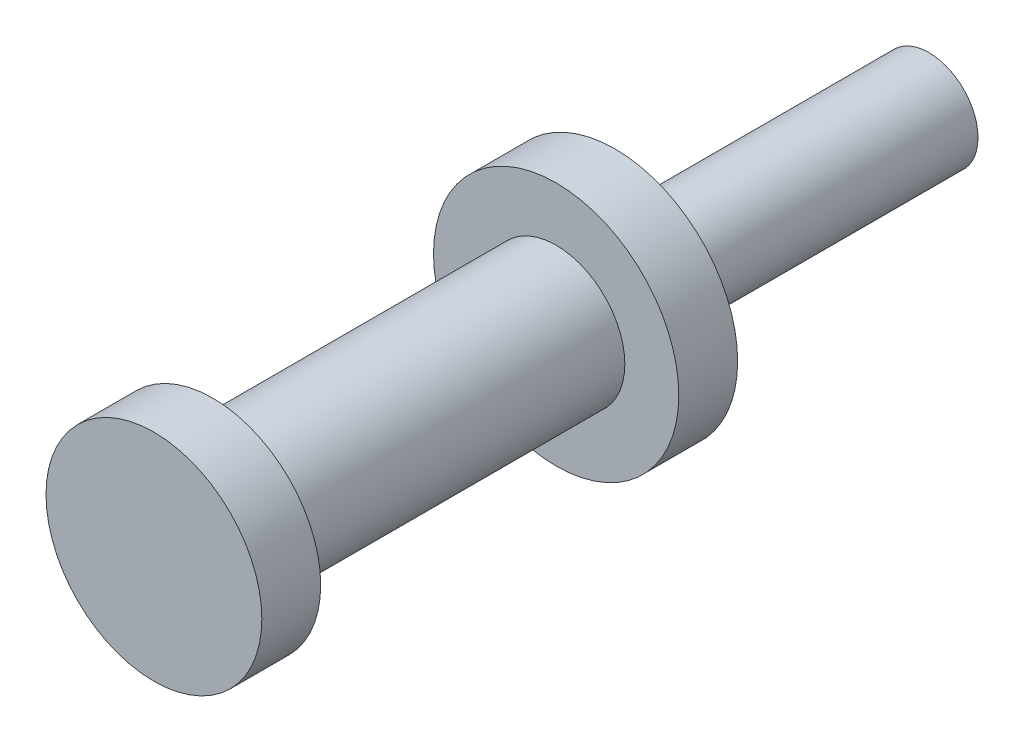
ISO-10303-21;
HEADER;
FILE_DESCRIPTION(('STEP AP214'),'2;1');
FILE_NAME('part.step','',(''),(''),'','','');
FILE_SCHEMA(('AUTOMOTIVE_DESIGN { 1 0 10303 214 1 1 1 1 }'));
ENDSEC;
DATA;
#1=APPLICATION_CONTEXT('core data for automotive mechanical design processes');
#2=APPLICATION_PROTOCOL_DEFINITION('international standard','automotive_design',2000,#1);
#3=PRODUCT_CONTEXT('',#1,'mechanical');
#4=PRODUCT('Part','Part','',(#3));
#5=PRODUCT_RELATED_PRODUCT_CATEGORY('part','',(#4));
#6=PRODUCT_DEFINITION_FORMATION('','',#4);
#7=PRODUCT_DEFINITION_CONTEXT('part definition',#1,'design');
#8=PRODUCT_DEFINITION('design','',#6,#7);
#9=PRODUCT_DEFINITION_SHAPE('','',#8);
#10=(LENGTH_UNIT() NAMED_UNIT(*) SI_UNIT(.MILLI.,.METRE.));
#11=(NAMED_UNIT(*) PLANE_ANGLE_UNIT() SI_UNIT($,.RADIAN.));
#12=(NAMED_UNIT(*) SI_UNIT($,.STERADIAN.) SOLID_ANGLE_UNIT());
#13=UNCERTAINTY_MEASURE_WITH_UNIT(LENGTH_MEASURE(1.E-05),#10,'distance_accuracy_value','');
#14=(GEOMETRIC_REPRESENTATION_CONTEXT(3) GLOBAL_UNCERTAINTY_ASSIGNED_CONTEXT((#13)) GLOBAL_UNIT_ASSIGNED_CONTEXT((#10,
#11,#12)) REPRESENTATION_CONTEXT('',''));
#15=CARTESIAN_POINT('',(0.,0.,0.));
#16=DIRECTION('',(0.,0.,1.));
#17=DIRECTION('',(1.,0.,0.));
#18=AXIS2_PLACEMENT_3D('',#15,#16,#17);
#19=CARTESIAN_POINT('',(0.,0.,0.));
#20=DIRECTION('',(0.,0.,-1.));
#21=DIRECTION('',(-1.,0.,0.));
#22=AXIS2_PLACEMENT_3D('',#19,#20,#21);
#23=PLANE('',#22);
#24=CARTESIAN_POINT('',(0.,-1.1,0.));
#25=DIRECTION('',(0.,0.,1.));
#26=DIRECTION('',(1.,0.,0.));
#27=AXIS2_PLACEMENT_3D('',#24,#25,#26);
#28=CIRCLE('',#27,1.1);
#29=CARTESIAN_POINT('',(1.1,-1.1,0.));
#30=VERTEX_POINT('',#29);
#31=EDGE_CURVE('E59',#30,#30,#28,.T.);
#32=ORIENTED_EDGE('',*,*,#31,.T.);
#33=EDGE_LOOP('',(#32));
#34=FACE_BOUND('',#33,.T.);
#35=ADVANCED_FACE('F31',(#34),#23,.F.);
#36=CARTESIAN_POINT('',(0.,-0.6,-7.9));
#37=DIRECTION('',(0.,0.,1.));
#38=DIRECTION('',(1.,0.,0.));
#39=AXIS2_PLACEMENT_3D('',#36,#37,#38);
#40=PLANE('',#39);
#41=CARTESIAN_POINT('',(0.,-1.1,-7.9));
#42=DIRECTION('',(0.,0.,1.));
#43=DIRECTION('',(1.,0.,0.));
#44=AXIS2_PLACEMENT_3D('',#41,#42,#43);
#45=CIRCLE('',#44,0.5);
#46=CARTESIAN_POINT('',(0.5,-1.1,-7.9));
#47=VERTEX_POINT('',#46);
#48=EDGE_CURVE('E10',#47,#47,#45,.T.);
#49=ORIENTED_EDGE('',*,*,#48,.F.);
#50=EDGE_LOOP('',(#49));
#51=FACE_BOUND('',#50,.T.);
#52=ADVANCED_FACE('F101',(#51),#40,.F.);
#53=CARTESIAN_POINT('',(0.,-1.1,0.));
#54=DIRECTION('',(0.,0.,1.));
#55=DIRECTION('',(1.,0.,0.));
#56=AXIS2_PLACEMENT_3D('',#53,#54,#55);
#57=CYLINDRICAL_SURFACE('',#56,0.5);
#58=CARTESIAN_POINT('',(0.,-1.1,-4.7));
#59=DIRECTION('',(0.,0.,1.));
#60=DIRECTION('',(1.,0.,0.));
#61=AXIS2_PLACEMENT_3D('',#58,#59,#60);
#62=CIRCLE('',#61,0.5);
#63=CARTESIAN_POINT('',(0.5,-1.1,-4.7));
#64=VERTEX_POINT('',#63);
#65=EDGE_CURVE('E37',#64,#64,#62,.T.);
#66=ORIENTED_EDGE('',*,*,#65,.F.);
#67=EDGE_LOOP('',(#66));
#68=FACE_BOUND('',#67,.T.);
#69=ORIENTED_EDGE('',*,*,#48,.T.);
#70=EDGE_LOOP('',(#69));
#71=FACE_BOUND('',#70,.T.);
#72=ADVANCED_FACE('F96',(#68,#71),#57,.T.);
#73=CARTESIAN_POINT('',(0.,0.15,-4.7));
#74=DIRECTION('',(0.,0.,1.));
#75=DIRECTION('',(1.,0.,0.));
#76=AXIS2_PLACEMENT_3D('',#73,#74,#75);
#77=PLANE('',#76);
#78=CARTESIAN_POINT('',(0.,-1.1,-4.7));
#79=DIRECTION('',(0.,0.,1.));
#80=DIRECTION('',(1.,0.,0.));
#81=AXIS2_PLACEMENT_3D('',#78,#79,#80);
#82=CIRCLE('',#81,1.25);
#83=CARTESIAN_POINT('',(1.25,-1.1,-4.7));
#84=VERTEX_POINT('',#83);
#85=EDGE_CURVE('E41',#84,#84,#82,.T.);
#86=ORIENTED_EDGE('',*,*,#85,.F.);
#87=EDGE_LOOP('',(#86));
#88=FACE_BOUND('',#87,.T.);
#89=ORIENTED_EDGE('',*,*,#65,.T.);
#90=EDGE_LOOP('',(#89));
#91=FACE_BOUND('',#90,.T.);
#92=ADVANCED_FACE('F91',(#88,#91),#77,.F.);
#93=CARTESIAN_POINT('',(0.,-1.1,0.));
#94=DIRECTION('',(0.,0.,1.));
#95=DIRECTION('',(1.,0.,0.));
#96=AXIS2_PLACEMENT_3D('',#93,#94,#95);
#97=CYLINDRICAL_SURFACE('',#96,1.25);
#98=CARTESIAN_POINT('',(0.,-1.1,-4.1));
#99=DIRECTION('',(0.,0.,1.));
#100=DIRECTION('',(1.,0.,0.));
#101=AXIS2_PLACEMENT_3D('',#98,#99,#100);
#102=CIRCLE('',#101,1.25);
#103=CARTESIAN_POINT('',(1.25,-1.1,-4.1));
#104=VERTEX_POINT('',#103);
#105=EDGE_CURVE('E45',#104,#104,#102,.T.);
#106=ORIENTED_EDGE('',*,*,#105,.F.);
#107=EDGE_LOOP('',(#106));
#108=FACE_BOUND('',#107,.T.);
#109=ORIENTED_EDGE('',*,*,#85,.T.);
#110=EDGE_LOOP('',(#109));
#111=FACE_BOUND('',#110,.T.);
#112=ADVANCED_FACE('F85',(#108,#111),#97,.T.);
#113=CARTESIAN_POINT('',(0.,-0.4,-4.1));
#114=DIRECTION('',(0.,0.,-1.));
#115=DIRECTION('',(-1.,0.,0.));
#116=AXIS2_PLACEMENT_3D('',#113,#114,#115);
#117=PLANE('',#116);
#118=CARTESIAN_POINT('',(0.,-1.1,-4.1));
#119=DIRECTION('',(0.,0.,1.));
#120=DIRECTION('',(1.,0.,0.));
#121=AXIS2_PLACEMENT_3D('',#118,#119,#120);
#122=CIRCLE('',#121,0.7);
#123=CARTESIAN_POINT('',(0.7,-1.1,-4.1));
#124=VERTEX_POINT('',#123);
#125=EDGE_CURVE('E50',#124,#124,#122,.T.);
#126=ORIENTED_EDGE('',*,*,#125,.F.);
#127=EDGE_LOOP('',(#126));
#128=FACE_BOUND('',#127,.T.);
#129=ORIENTED_EDGE('',*,*,#105,.T.);
#130=EDGE_LOOP('',(#129));
#131=FACE_BOUND('',#130,.T.);
#132=ADVANCED_FACE('F79',(#128,#131),#117,.F.);
#133=CARTESIAN_POINT('',(0.,-1.1,0.));
#134=DIRECTION('',(0.,0.,1.));
#135=DIRECTION('',(1.,0.,0.));
#136=AXIS2_PLACEMENT_3D('',#133,#134,#135);
#137=CYLINDRICAL_SURFACE('',#136,0.7);
#138=CARTESIAN_POINT('',(0.,-1.1,-0.6));
#139=DIRECTION('',(0.,0.,1.));
#140=DIRECTION('',(1.,0.,0.));
#141=AXIS2_PLACEMENT_3D('',#138,#139,#140);
#142=CIRCLE('',#141,0.7);
#143=CARTESIAN_POINT('',(0.7,-1.1,-0.6));
#144=VERTEX_POINT('',#143);
#145=EDGE_CURVE('E53',#144,#144,#142,.T.);
#146=ORIENTED_EDGE('',*,*,#145,.F.);
#147=EDGE_LOOP('',(#146));
#148=FACE_BOUND('',#147,.T.);
#149=ORIENTED_EDGE('',*,*,#125,.T.);
#150=EDGE_LOOP('',(#149));
#151=FACE_BOUND('',#150,.T.);
#152=ADVANCED_FACE('F73',(#148,#151),#137,.T.);
#153=CARTESIAN_POINT('',(0.,0.,-0.6));
#154=DIRECTION('',(0.,0.,1.));
#155=DIRECTION('',(1.,0.,0.));
#156=AXIS2_PLACEMENT_3D('',#153,#154,#155);
#157=PLANE('',#156);
#158=CARTESIAN_POINT('',(0.,-1.1,-0.6));
#159=DIRECTION('',(0.,0.,1.));
#160=DIRECTION('',(1.,0.,0.));
#161=AXIS2_PLACEMENT_3D('',#158,#159,#160);
#162=CIRCLE('',#161,1.1);
#163=CARTESIAN_POINT('',(1.1,-1.1,-0.6));
#164=VERTEX_POINT('',#163);
#165=EDGE_CURVE('E56',#164,#164,#162,.T.);
#166=ORIENTED_EDGE('',*,*,#165,.F.);
#167=EDGE_LOOP('',(#166));
#168=FACE_BOUND('',#167,.T.);
#169=ORIENTED_EDGE('',*,*,#145,.T.);
#170=EDGE_LOOP('',(#169));
#171=FACE_BOUND('',#170,.T.);
#172=ADVANCED_FACE('F67',(#168,#171),#157,.F.);
#173=CARTESIAN_POINT('',(0.,-1.1,0.));
#174=DIRECTION('',(0.,0.,1.));
#175=DIRECTION('',(1.,0.,0.));
#176=AXIS2_PLACEMENT_3D('',#173,#174,#175);
#177=CYLINDRICAL_SURFACE('',#176,1.1);
#178=ORIENTED_EDGE('',*,*,#31,.F.);
#179=EDGE_LOOP('',(#178));
#180=FACE_BOUND('',#179,.T.);
#181=ORIENTED_EDGE('',*,*,#165,.T.);
#182=EDGE_LOOP('',(#181));
#183=FACE_BOUND('',#182,.T.);
#184=ADVANCED_FACE('F64',(#180,#183),#177,.T.);
#185=CLOSED_SHELL('',(#35,#52,#72,#92,#112,#132,#152,#172,#184));
#186=MANIFOLD_SOLID_BREP('B2',#185);
#187=ADVANCED_BREP_SHAPE_REPRESENTATION('',(#18,#186),#14);
#188=SHAPE_DEFINITION_REPRESENTATION(#9,#187);
ENDSEC;
END-ISO-10303-21;
